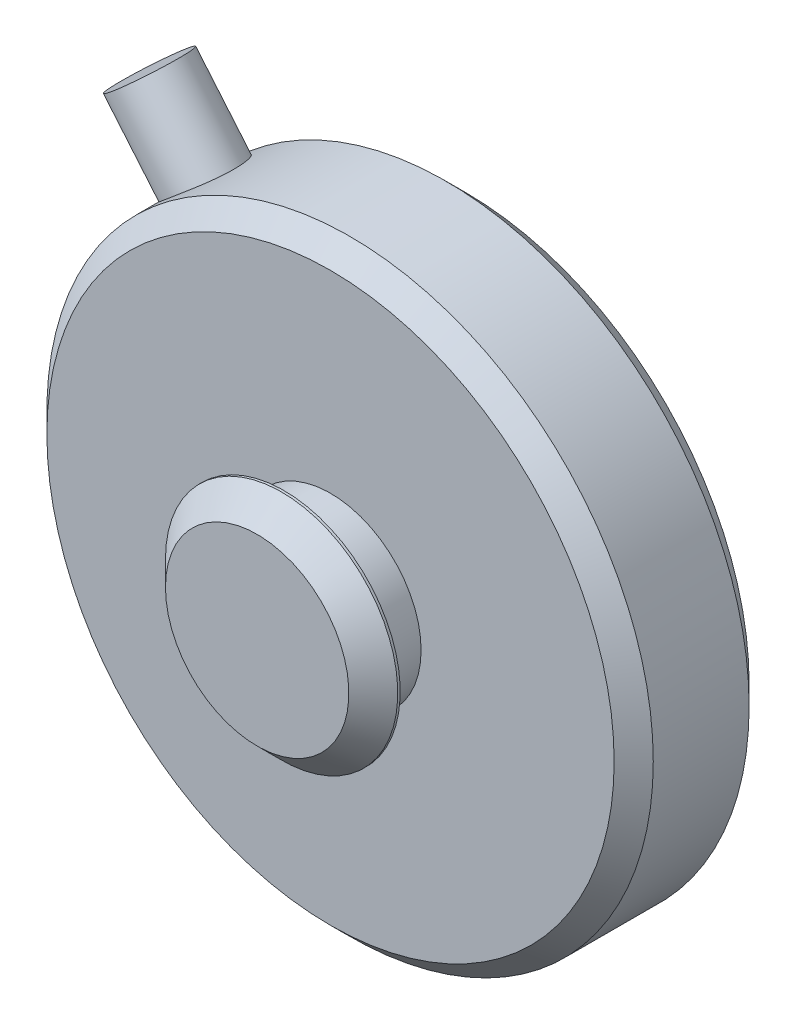
ISO-10303-21;
HEADER;
FILE_DESCRIPTION(('STEP AP214'),'2;1');
FILE_NAME('part.step','',(''),(''),'','','');
FILE_SCHEMA(('AUTOMOTIVE_DESIGN { 1 0 10303 214 1 1 1 1 }'));
ENDSEC;
DATA;
#1=APPLICATION_CONTEXT('core data for automotive mechanical design processes');
#2=APPLICATION_PROTOCOL_DEFINITION('international standard','automotive_design',2000,#1);
#3=PRODUCT_CONTEXT('',#1,'mechanical');
#4=PRODUCT('Part','Part','',(#3));
#5=PRODUCT_RELATED_PRODUCT_CATEGORY('part','',(#4));
#6=PRODUCT_DEFINITION_FORMATION('','',#4);
#7=PRODUCT_DEFINITION_CONTEXT('part definition',#1,'design');
#8=PRODUCT_DEFINITION('design','',#6,#7);
#9=PRODUCT_DEFINITION_SHAPE('','',#8);
#10=(LENGTH_UNIT() NAMED_UNIT(*) SI_UNIT(.MILLI.,.METRE.));
#11=(NAMED_UNIT(*) PLANE_ANGLE_UNIT() SI_UNIT($,.RADIAN.));
#12=(NAMED_UNIT(*) SI_UNIT($,.STERADIAN.) SOLID_ANGLE_UNIT());
#13=UNCERTAINTY_MEASURE_WITH_UNIT(LENGTH_MEASURE(1.E-05),#10,'distance_accuracy_value','');
#14=(GEOMETRIC_REPRESENTATION_CONTEXT(3) GLOBAL_UNCERTAINTY_ASSIGNED_CONTEXT((#13)) GLOBAL_UNIT_ASSIGNED_CONTEXT((#10,
#11,#12)) REPRESENTATION_CONTEXT('',''));
#15=CARTESIAN_POINT('',(0.,0.,0.));
#16=DIRECTION('',(0.,0.,1.));
#17=DIRECTION('',(1.,0.,0.));
#18=AXIS2_PLACEMENT_3D('',#15,#16,#17);
#19=CARTESIAN_POINT('',(0.,0.,70.104));
#20=DIRECTION('',(0.,0.,-1.));
#21=DIRECTION('',(-1.,0.,0.));
#22=AXIS2_PLACEMENT_3D('',#19,#20,#21);
#23=CYLINDRICAL_SURFACE('',#22,157.48);
#24=CARTESIAN_POINT('',(0.,0.,59.944));
#25=DIRECTION('',(0.,0.,1.));
#26=DIRECTION('',(1.,0.,0.));
#27=AXIS2_PLACEMENT_3D('',#24,#25,#26);
#28=CIRCLE('',#27,157.48);
#29=CARTESIAN_POINT('',(157.48,0.,59.944));
#30=VERTEX_POINT('',#29);
#31=EDGE_CURVE('E63',#30,#30,#28,.F.);
#32=ORIENTED_EDGE('',*,*,#31,.T.);
#33=EDGE_LOOP('',(#32));
#34=FACE_BOUND('',#33,.T.);
#35=CARTESIAN_POINT('',(0.,0.,10.1600000000001));
#36=DIRECTION('',(0.,0.,1.));
#37=DIRECTION('',(1.,0.,0.));
#38=AXIS2_PLACEMENT_3D('',#35,#36,#37);
#39=CIRCLE('',#38,157.48);
#40=CARTESIAN_POINT('',(157.48,0.,10.1600000000001));
#41=VERTEX_POINT('',#40);
#42=EDGE_CURVE('E60',#41,#41,#39,.T.);
#43=ORIENTED_EDGE('',*,*,#42,.T.);
#44=EDGE_LOOP('',(#43));
#45=FACE_BOUND('',#44,.T.);
#46=CARTESIAN_POINT('',(-115.075978669095,107.505672098499,34.2900000000001));
#47=CARTESIAN_POINT('',(-115.075981956231,107.505666742398,34.8231063645392));
#48=CARTESIAN_POINT('',(-115.060586298273,107.522154970393,35.3561246507377));
#49=CARTESIAN_POINT('',(-114.999081791675,107.587934793928,36.4185207814599));
#50=CARTESIAN_POINT('',(-114.952965908508,107.637233902726,36.9478977641156));
#51=CARTESIAN_POINT('',(-114.830182011273,107.768212945769,37.999561538486));
#52=CARTESIAN_POINT('',(-114.753484488234,107.849924154846,38.5218409767915));
#53=CARTESIAN_POINT('',(-114.569928895355,108.044896704996,39.5550578291863));
#54=CARTESIAN_POINT('',(-114.463072542118,108.15815625037,40.0659958870284));
#55=CARTESIAN_POINT('',(-114.219812022387,108.415018236476,41.0726169164407));
#56=CARTESIAN_POINT('',(-114.083427134799,108.558600878043,41.5683096015502));
#57=CARTESIAN_POINT('',(-113.781749375362,108.874751977493,42.541319621696));
#58=CARTESIAN_POINT('',(-113.616456117651,109.047320822275,43.0186367113549));
#59=CARTESIAN_POINT('',(-113.257825785251,109.419751779565,43.9514752054481));
#60=CARTESIAN_POINT('',(-113.064494010221,109.619608733833,44.4070007071977));
#61=CARTESIAN_POINT('',(-112.650739051799,110.044760620328,45.2931968527398));
#62=CARTESIAN_POINT('',(-112.430315851306,110.270055568614,45.7238674808425));
#63=CARTESIAN_POINT('',(-111.962406154477,110.745120183841,46.5593366116437));
#64=CARTESIAN_POINT('',(-111.714797577077,110.994999683982,46.9640042978188));
#65=CARTESIAN_POINT('',(-111.194663765932,111.516064408958,47.7424304563291));
#66=CARTESIAN_POINT('',(-110.922138438299,111.787249714073,48.1161888121879));
#67=CARTESIAN_POINT('',(-110.353615515967,112.348517875241,48.8302012335807));
#68=CARTESIAN_POINT('',(-110.057616788187,112.638601643418,49.1704536799792));
#69=CARTESIAN_POINT('',(-109.44378578764,113.235114993216,49.8150420046939));
#70=CARTESIAN_POINT('',(-109.125953499928,113.541544586026,50.1193778584249));
#71=CARTESIAN_POINT('',(-108.469240176414,114.169090410847,50.6908610778762));
#72=CARTESIAN_POINT('',(-108.130296918057,114.490249243946,50.9578901817623));
#73=CARTESIAN_POINT('',(-107.434257054097,115.143643443496,51.4517128745542));
#74=CARTESIAN_POINT('',(-107.077160398733,115.475878840309,51.6785063531605));
#75=CARTESIAN_POINT('',(-106.347013211455,116.148652932663,52.0901974622468));
#76=CARTESIAN_POINT('',(-105.973963113776,116.489191402096,52.2750962321918));
#77=CARTESIAN_POINT('',(-105.214274007777,117.175804053988,52.6016406523737));
#78=CARTESIAN_POINT('',(-104.827635070674,117.521878207428,52.7432865292575));
#79=CARTESIAN_POINT('',(-104.045243230053,118.215098775633,52.9816833330641));
#80=CARTESIAN_POINT('',(-103.64954437086,118.562231591539,53.0786511904845));
#81=CARTESIAN_POINT('',(-102.849887640687,119.256577965041,53.2279910066635));
#82=CARTESIAN_POINT('',(-102.445929793943,119.603791522399,53.2803630962758));
#83=CARTESIAN_POINT('',(-101.632582652601,120.29569234035,53.3401184129735));
#84=CARTESIAN_POINT('',(-101.223193536414,120.640379683352,53.3475031141921));
#85=CARTESIAN_POINT('',(-100.401903143218,121.324745880084,53.317232068117));
#86=CARTESIAN_POINT('',(-99.9900018732307,121.6644247478,53.2795764466276));
#87=CARTESIAN_POINT('',(-99.1688658755673,122.334646981106,53.1598223038452));
#88=CARTESIAN_POINT('',(-98.7596284767233,122.665228861847,53.0779574712857));
#89=CARTESIAN_POINT('',(-97.9446920025025,123.316908507528,52.870542975148));
#90=CARTESIAN_POINT('',(-97.5389929127791,123.638006310933,52.7449934887797));
#91=CARTESIAN_POINT('',(-96.7341876806402,124.268695700632,52.4511279111364));
#92=CARTESIAN_POINT('',(-96.3350816205461,124.578287143315,52.2828112862944));
#93=CARTESIAN_POINT('',(-95.5465241954109,125.184101837674,51.9046332667945));
#94=CARTESIAN_POINT('',(-95.1570728672098,125.480325038344,51.6947717136389));
#95=CARTESIAN_POINT('',(-94.3898841037624,126.058444746087,51.2344289510525));
#96=CARTESIAN_POINT('',(-94.0121787249038,126.340303194494,50.9838465270971));
#97=CARTESIAN_POINT('',(-93.2725033577813,126.887360099209,50.4442266836837));
#98=CARTESIAN_POINT('',(-92.9105333862832,127.152558537767,50.155189223254));
#99=CARTESIAN_POINT('',(-92.2052195127385,127.664944057862,49.5406858401647));
#100=CARTESIAN_POINT('',(-91.8618762864209,127.912130486082,49.2152185972397));
#101=CARTESIAN_POINT('',(-91.1966230344424,128.387279240893,48.5301370664299));
#102=CARTESIAN_POINT('',(-90.8747131052486,128.61524148096,48.1705226248731));
#103=CARTESIAN_POINT('',(-90.2530000511413,129.052282924288,47.4172333901064));
#104=CARTESIAN_POINT('',(-89.9533518088281,129.261231761214,47.0233551005706));
#105=CARTESIAN_POINT('',(-89.3810090028774,129.657652510021,46.206294621352));
#106=CARTESIAN_POINT('',(-89.1083145614574,129.845124324518,45.7831122988098));
#107=CARTESIAN_POINT('',(-88.5922411438221,130.197783871449,44.910401486561));
#108=CARTESIAN_POINT('',(-88.348862325544,130.362971483828,44.4608728549337));
#109=CARTESIAN_POINT('',(-87.8935703612461,130.670372211277,43.5386229127299));
#110=CARTESIAN_POINT('',(-87.6816571584481,130.812585367804,43.0659016440055));
#111=CARTESIAN_POINT('',(-87.2911248910344,131.073510372118,42.1004055644499));
#112=CARTESIAN_POINT('',(-87.1125188199588,131.192213049281,41.6076230184085));
#113=CARTESIAN_POINT('',(-86.7903383881949,131.405574174539,40.6056701132744));
#114=CARTESIAN_POINT('',(-86.6467640621405,131.500232598862,40.0964997379804));
#115=CARTESIAN_POINT('',(-86.3959878617275,131.665129116188,39.0654256454396));
#116=CARTESIAN_POINT('',(-86.2887846466326,131.735368109359,38.5435223983209));
#117=CARTESIAN_POINT('',(-86.1117546335724,131.851155931425,37.4907159182353));
#118=CARTESIAN_POINT('',(-86.041927627356,131.896704897886,36.9598127354308));
#119=CARTESIAN_POINT('',(-85.9406352304232,131.962726756453,35.8962153645797));
#120=CARTESIAN_POINT('',(-85.9089300963237,131.983356366907,35.3635537209783));
#121=CARTESIAN_POINT('',(-85.8833798063421,131.999983748173,34.2969405307324));
#122=CARTESIAN_POINT('',(-85.8895344918539,131.995981622176,33.762988989501));
#123=CARTESIAN_POINT('',(-85.9396448803183,131.963361300718,32.6976287312437));
#124=CARTESIAN_POINT('',(-85.983599862889,131.93474357437,32.1662199659528));
#125=CARTESIAN_POINT('',(-86.1088948759833,131.853002264134,31.1097332275515));
#126=CARTESIAN_POINT('',(-86.1902348873098,131.799878692829,30.5846552511905));
#127=CARTESIAN_POINT('',(-86.389222617466,131.669535941278,29.5462100839902));
#128=CARTESIAN_POINT('',(-86.5067550741846,131.592393246204,29.0328111946997));
#129=CARTESIAN_POINT('',(-86.7771279890669,131.414255853258,28.0196327138986));
#130=CARTESIAN_POINT('',(-86.9299683477337,131.3132612226,27.5198530840137));
#131=CARTESIAN_POINT('',(-87.2695728571734,131.087808599911,26.5373922142867));
#132=CARTESIAN_POINT('',(-87.4563378747376,130.963350008362,26.0547114117045));
#133=CARTESIAN_POINT('',(-87.8621201247093,130.69146054306,25.1098106510844));
#134=CARTESIAN_POINT('',(-88.0811375218974,130.544029551937,24.6475907975991));
#135=CARTESIAN_POINT('',(-88.5506620020646,130.226001315349,23.7445718135778));
#136=CARTESIAN_POINT('',(-88.8013196579117,130.055292960939,23.3038900991474));
#137=CARTESIAN_POINT('',(-89.3310832667231,129.691985423839,22.4494743074258));
#138=CARTESIAN_POINT('',(-89.6101893022965,129.499386177581,22.0357403083918));
#139=CARTESIAN_POINT('',(-90.1944731289451,129.093121387352,21.238076299478));
#140=CARTESIAN_POINT('',(-90.4996517576856,128.879455166504,20.8541472479344));
#141=CARTESIAN_POINT('',(-91.1335095634046,128.432022052273,20.1187742987307));
#142=CARTESIAN_POINT('',(-91.4621888069585,128.198255101946,19.7673304931051));
#143=CARTESIAN_POINT('',(-92.1421422377958,127.710422410367,19.097598153332));
#144=CARTESIAN_POINT('',(-92.4935276187735,127.45625502429,18.7794965143477));
#145=CARTESIAN_POINT('',(-93.2144148588049,126.929990084886,18.1808666796957));
#146=CARTESIAN_POINT('',(-93.5839167921586,126.657892458021,17.9003386381435));
#147=CARTESIAN_POINT('',(-94.33803348661,126.097210762074,17.3788744943235));
#148=CARTESIAN_POINT('',(-94.7226480457642,125.808626913269,17.1379378632357));
#149=CARTESIAN_POINT('',(-95.5039147699875,125.216583771448,16.6974026099164));
#150=CARTESIAN_POINT('',(-95.9005668875399,124.913124537148,16.4978038245341));
#151=CARTESIAN_POINT('',(-96.701758906016,124.293909273488,16.14186229683));
#152=CARTESIAN_POINT('',(-97.1062762356809,123.97818640399,15.9854110689521));
#153=CARTESIAN_POINT('',(-97.9210400549139,123.335677947544,15.7162513634477));
#154=CARTESIAN_POINT('',(-98.3312865382727,123.008892372587,15.6035428384159));
#155=CARTESIAN_POINT('',(-99.1543683983212,122.346396329997,15.4227125789214));
#156=CARTESIAN_POINT('',(-99.5672036831479,122.010686177697,15.3545892712998));
#157=CARTESIAN_POINT('',(-100.392389873754,121.332615650315,15.2634350475816));
#158=CARTESIAN_POINT('',(-100.804740781755,120.990255305852,15.240403923914));
#159=CARTESIAN_POINT('',(-101.623317006693,120.303513846195,15.2396091573007));
#160=CARTESIAN_POINT('',(-102.029564627974,119.959159615326,15.2615572496468));
#161=CARTESIAN_POINT('',(-102.835742904735,119.268780578809,15.3499778537598));
#162=CARTESIAN_POINT('',(-103.235673589019,118.922755780788,15.4164501624378));
#163=CARTESIAN_POINT('',(-104.026480891724,118.231626257682,15.5934258843502));
#164=CARTESIAN_POINT('',(-104.417357536762,117.886521529895,15.7039291681235));
#165=CARTESIAN_POINT('',(-105.18746790316,117.199885461876,15.9681529631312));
#166=CARTESIAN_POINT('',(-105.56670160326,116.85835412817,16.1218735532708));
#167=CARTESIAN_POINT('',(-106.310979851016,116.181663254184,16.4713549182159));
#168=CARTESIAN_POINT('',(-106.67602880444,115.846501752234,16.6671025141979));
#169=CARTESIAN_POINT('',(-107.389809310632,115.185137968591,17.0992534986387));
#170=CARTESIAN_POINT('',(-107.738540876198,114.85893567987,17.3356568552079));
#171=CARTESIAN_POINT('',(-108.417612288711,114.218167168577,17.8474338079367));
#172=CARTESIAN_POINT('',(-108.747952111214,113.903600961469,18.1228074558871));
#173=CARTESIAN_POINT('',(-109.388343926948,113.288735948809,18.7105832724219));
#174=CARTESIAN_POINT('',(-109.698395831342,112.988437205733,19.0229856031296));
#175=CARTESIAN_POINT('',(-110.298326557156,112.402875282886,19.6846636721671));
#176=CARTESIAN_POINT('',(-110.588069902347,112.117715683798,20.0341539319831));
#177=CARTESIAN_POINT('',(-111.143697266452,111.566939641962,20.7659623401381));
#178=CARTESIAN_POINT('',(-111.409581106397,111.301323345811,21.148280734678));
#179=CARTESIAN_POINT('',(-111.916136460886,110.79195767178,21.943172739707));
#180=CARTESIAN_POINT('',(-112.156801860842,110.548213599199,22.3557536467619));
#181=CARTESIAN_POINT('',(-112.611589894974,110.084901928611,23.2082077345002));
#182=CARTESIAN_POINT('',(-112.82571287981,109.86533401121,23.6480805545056));
#183=CARTESIAN_POINT('',(-113.22704485836,109.451679283116,24.5536896065374));
#184=CARTESIAN_POINT('',(-113.414153942452,109.257687282268,25.0195134408414));
#185=CARTESIAN_POINT('',(-113.75958682009,108.897975279947,25.9723066327804));
#186=CARTESIAN_POINT('',(-113.917908845469,108.732257015151,26.4592772870285));
#187=CARTESIAN_POINT('',(-114.204804233235,108.430882991487,27.4504000365124));
#188=CARTESIAN_POINT('',(-114.333407348545,108.295197171596,27.9545343630279));
#189=CARTESIAN_POINT('',(-114.56038362123,108.055060640918,28.9766734760748));
#190=CARTESIAN_POINT('',(-114.65876396539,107.950602504541,29.4946749331886));
#191=CARTESIAN_POINT('',(-114.852841605464,107.744150385155,30.7174912110674));
#192=CARTESIAN_POINT('',(-114.936463317268,107.654848379762,31.4264368991206));
#193=CARTESIAN_POINT('',(-115.048029442311,107.535613049452,32.8536417052711));
#194=CARTESIAN_POINT('',(-115.075974241292,107.505679313216,33.5719007588082));
#195=CARTESIAN_POINT('',(-115.075978669095,107.505672098499,34.2900000000001));
#196=B_SPLINE_CURVE_WITH_KNOTS('',3,(#46,#47,#48,#49,#50,#51,#52,#53,#54,#55,#56,#57,#58,#59,
#60,#61,#62,#63,#64,#65,#66,#67,#68,#69,#70,#71,#72,#73,#74,#75,#76,#77,#78,#79,#80,#81,#82,#83,
#84,#85,#86,#87,#88,#89,#90,#91,#92,#93,#94,#95,#96,#97,#98,#99,#100,#101,#102,#103,#104,#105,
#106,#107,#108,#109,#110,#111,#112,#113,#114,#115,#116,#117,#118,#119,#120,#121,#122,#123,#124,
#125,#126,#127,#128,#129,#130,#131,#132,#133,#134,#135,#136,#137,#138,#139,#140,#141,#142,#143,
#144,#145,#146,#147,#148,#149,#150,#151,#152,#153,#154,#155,#156,#157,#158,#159,#160,#161,#162,
#163,#164,#165,#166,#167,#168,#169,#170,#171,#172,#173,#174,#175,#176,#177,#178,#179,#180,#181,
#182,#183,#184,#185,#186,#187,#188,#189,#190,#191,#192,#193,#194,#195),.UNSPECIFIED.,.T.,.F.,(4,
2,2,2,2,2,2,2,2,2,2,2,2,2,2,2,2,2,2,2,2,2,2,2,2,2,2,2,2,2,2,2,2,2,2,2,2,2,2,2,2,2,2,2,2,2,2,2,2,
2,2,2,2,2,2,2,2,2,2,2,2,2,2,2,2,2,2,2,2,2,2,2,2,2,4),(0.,1.5986906597407,3.19774752452833,
4.79835110689439,6.39886360321042,7.99833427405036,9.59782629593038,11.1970163852108,
12.7962074839783,14.4028989590735,16.0095964884345,17.6163716215878,19.2231478545913,
20.83490726724,22.4466710981978,24.0583910866516,25.6701026294879,27.2739039619148,
28.8777005884217,30.4814446619199,32.0851842559325,33.6805283378331,35.2758659481809,
36.8712234630946,38.4665870645647,40.0659784708004,41.6653715811106,43.2648226744108,
44.8642809660384,46.4739888170811,48.0837039667334,49.6934277882969,51.3031487051589,
52.9134962871313,54.5238454611513,56.1341352669428,57.7444161005045,59.3445162198905,
60.9446096359813,62.544672558852,64.144734660091,65.7397528399694,67.3347665251799,
68.9298209694933,70.524883563375,72.1278452747064,73.7308116408918,75.3338295268747,
76.936851954258,78.548426893619,80.1600084429621,81.7715684647554,83.3831221259694,
84.9905861437894,86.5980484195471,88.2054539740405,89.8128521292156,91.4099809432266,
93.0071024722776,94.6042193054552,96.2013390546257,97.7979587087488,99.3945771105179,
100.991197634181,102.587825148613,104.194250939961,105.800688780057,107.40751522819,
109.014320445728,110.626923951549,112.239626473833,113.850707384709,115.46140489349,
117.61487103058,119.768322247867),.UNSPECIFIED.);
#197=CARTESIAN_POINT('',(-115.075978669095,107.505672098499,34.2900000000001));
#198=VERTEX_POINT('',#197);
#199=EDGE_CURVE('E10',#198,#198,#196,.T.);
#200=ORIENTED_EDGE('',*,*,#199,.F.);
#201=EDGE_LOOP('',(#200));
#202=FACE_BOUND('',#201,.T.);
#203=ADVANCED_FACE('F34',(#34,#45,#202),#23,.T.);
#204=CARTESIAN_POINT('',(0.,0.,-19.812));
#205=DIRECTION('',(0.,0.,-1.));
#206=DIRECTION('',(-1.,0.,0.));
#207=AXIS2_PLACEMENT_3D('',#204,#205,#206);
#208=PLANE('',#207);
#209=CARTESIAN_POINT('',(0.,0.,-19.812));
#210=DIRECTION('',(0.,0.,-1.));
#211=DIRECTION('',(-1.,0.,0.));
#212=AXIS2_PLACEMENT_3D('',#209,#210,#211);
#213=CIRCLE('',#212,24.511);
#214=CARTESIAN_POINT('',(-24.511,0.,-19.812));
#215=VERTEX_POINT('',#214);
#216=EDGE_CURVE('E78',#215,#215,#213,.T.);
#217=ORIENTED_EDGE('',*,*,#216,.T.);
#218=EDGE_LOOP('',(#217));
#219=FACE_BOUND('',#218,.T.);
#220=CARTESIAN_POINT('',(0.,0.,-19.812));
#221=DIRECTION('',(0.,0.,-1.));
#222=DIRECTION('',(-1.,0.,0.));
#223=AXIS2_PLACEMENT_3D('',#220,#221,#222);
#224=CIRCLE('',#223,15.875);
#225=CARTESIAN_POINT('',(-15.875,0.,-19.812));
#226=VERTEX_POINT('',#225);
#227=EDGE_CURVE('E87',#226,#226,#224,.T.);
#228=ORIENTED_EDGE('',*,*,#227,.F.);
#229=EDGE_LOOP('',(#228));
#230=FACE_BOUND('',#229,.T.);
#231=ADVANCED_FACE('F137',(#219,#230),#208,.T.);
#232=CARTESIAN_POINT('',(0.,0.,0.));
#233=DIRECTION('',(0.,0.,1.));
#234=DIRECTION('',(1.,0.,0.));
#235=AXIS2_PLACEMENT_3D('',#232,#233,#234);
#236=PLANE('',#235);
#237=CARTESIAN_POINT('',(0.,0.,0.));
#238=DIRECTION('',(0.,0.,1.));
#239=DIRECTION('',(1.,0.,0.));
#240=AXIS2_PLACEMENT_3D('',#237,#238,#239);
#241=CIRCLE('',#240,147.32);
#242=CARTESIAN_POINT('',(147.32,0.,0.));
#243=VERTEX_POINT('',#242);
#244=EDGE_CURVE('E57',#243,#243,#241,.F.);
#245=ORIENTED_EDGE('',*,*,#244,.T.);
#246=EDGE_LOOP('',(#245));
#247=FACE_BOUND('',#246,.T.);
#248=CARTESIAN_POINT('',(36.2352532708452,-11.7735474856859,0.));
#249=DIRECTION('',(0.,0.,-1.));
#250=DIRECTION('',(-0.309016994374958,-0.95105651629515,0.));
#251=AXIS2_PLACEMENT_3D('',#248,#249,#250);
#252=CIRCLE('',#251,3.175);
#253=CARTESIAN_POINT('',(35.2541243137047,-14.793151924923,0.));
#254=VERTEX_POINT('',#253);
#255=EDGE_CURVE('E117',#254,#254,#252,.T.);
#256=ORIENTED_EDGE('',*,*,#255,.F.);
#257=EDGE_LOOP('',(#256));
#258=FACE_BOUND('',#257,.T.);
#259=CARTESIAN_POINT('',(22.3946181123435,30.8235474856853,0.));
#260=DIRECTION('',(0.,0.,-1.));
#261=DIRECTION('',(0.809016994374942,-0.58778525229248,0.));
#262=AXIS2_PLACEMENT_3D('',#259,#260,#261);
#263=CIRCLE('',#262,3.175);
#264=CARTESIAN_POINT('',(24.9632470694839,28.9573293096567,0.));
#265=VERTEX_POINT('',#264);
#266=EDGE_CURVE('E111',#265,#265,#263,.T.);
#267=ORIENTED_EDGE('',*,*,#266,.F.);
#268=EDGE_LOOP('',(#267));
#269=FACE_BOUND('',#268,.T.);
#270=CARTESIAN_POINT('',(-22.3946181123431,30.8235474856856,0.));
#271=DIRECTION('',(0.,0.,-1.));
#272=DIRECTION('',(0.809016994374951,0.587785252292469,0.));
#273=AXIS2_PLACEMENT_3D('',#270,#271,#272);
#274=CIRCLE('',#273,3.175);
#275=CARTESIAN_POINT('',(-19.8259891552026,32.6897656617142,0.));
#276=VERTEX_POINT('',#275);
#277=EDGE_CURVE('E105',#276,#276,#274,.T.);
#278=ORIENTED_EDGE('',*,*,#277,.F.);
#279=EDGE_LOOP('',(#278));
#280=FACE_BOUND('',#279,.T.);
#281=CARTESIAN_POINT('',(-36.2352532708454,-11.7735474856854,0.));
#282=DIRECTION('',(0.,0.,-1.));
#283=DIRECTION('',(-0.309016994374945,0.951056516295155,0.));
#284=AXIS2_PLACEMENT_3D('',#281,#282,#283);
#285=CIRCLE('',#284,3.175);
#286=CARTESIAN_POINT('',(-37.2163822279858,-8.75394304644828,0.));
#287=VERTEX_POINT('',#286);
#288=EDGE_CURVE('E99',#287,#287,#285,.T.);
#289=ORIENTED_EDGE('',*,*,#288,.F.);
#290=EDGE_LOOP('',(#289));
#291=FACE_BOUND('',#290,.T.);
#292=CARTESIAN_POINT('',(0.,-38.1,0.));
#293=DIRECTION('',(0.,0.,-1.));
#294=DIRECTION('',(-1.,0.,0.));
#295=AXIS2_PLACEMENT_3D('',#292,#293,#294);
#296=CIRCLE('',#295,3.175);
#297=CARTESIAN_POINT('',(-3.175,-38.1,0.));
#298=VERTEX_POINT('',#297);
#299=EDGE_CURVE('E93',#298,#298,#296,.T.);
#300=ORIENTED_EDGE('',*,*,#299,.F.);
#301=EDGE_LOOP('',(#300));
#302=FACE_BOUND('',#301,.T.);
#303=CARTESIAN_POINT('',(0.,0.,0.));
#304=DIRECTION('',(0.,0.,1.));
#305=DIRECTION('',(1.,0.,0.));
#306=AXIS2_PLACEMENT_3D('',#303,#304,#305);
#307=CIRCLE('',#306,15.0114);
#308=CARTESIAN_POINT('',(15.0114,0.,0.));
#309=VERTEX_POINT('',#308);
#310=EDGE_CURVE('E66',#309,#309,#307,.F.);
#311=ORIENTED_EDGE('',*,*,#310,.F.);
#312=EDGE_LOOP('',(#311));
#313=FACE_BOUND('',#312,.T.);
#314=ADVANCED_FACE('F142',(#247,#258,#269,#280,#291,#302,#313),#236,.F.);
#315=CARTESIAN_POINT('',(0.,0.,70.104));
#316=DIRECTION('',(0.,0.,1.));
#317=DIRECTION('',(1.,0.,0.));
#318=AXIS2_PLACEMENT_3D('',#315,#316,#317);
#319=PLANE('',#318);
#320=CARTESIAN_POINT('',(0.,0.,70.104));
#321=DIRECTION('',(0.,0.,1.));
#322=DIRECTION('',(1.,0.,0.));
#323=AXIS2_PLACEMENT_3D('',#320,#321,#322);
#324=CIRCLE('',#323,147.32);
#325=CARTESIAN_POINT('',(147.32,0.,70.104));
#326=VERTEX_POINT('',#325);
#327=EDGE_CURVE('E52',#326,#326,#324,.T.);
#328=ORIENTED_EDGE('',*,*,#327,.T.);
#329=EDGE_LOOP('',(#328));
#330=FACE_BOUND('',#329,.T.);
#331=CARTESIAN_POINT('',(0.,0.,70.104));
#332=DIRECTION('',(0.,0.,1.));
#333=DIRECTION('',(1.,0.,0.));
#334=AXIS2_PLACEMENT_3D('',#331,#332,#333);
#335=CIRCLE('',#334,47.0535);
#336=CARTESIAN_POINT('',(47.0535,0.,70.104));
#337=VERTEX_POINT('',#336);
#338=EDGE_CURVE('E72',#337,#337,#335,.T.);
#339=ORIENTED_EDGE('',*,*,#338,.F.);
#340=EDGE_LOOP('',(#339));
#341=FACE_BOUND('',#340,.T.);
#342=ADVANCED_FACE('F237',(#330,#341),#319,.T.);
#343=CARTESIAN_POINT('',(0.,0.,94.234));
#344=DIRECTION('',(0.,0.,-1.));
#345=DIRECTION('',(-1.,0.,0.));
#346=AXIS2_PLACEMENT_3D('',#343,#344,#345);
#347=CYLINDRICAL_SURFACE('',#346,47.0535);
#348=CARTESIAN_POINT('',(0.,0.,94.234));
#349=DIRECTION('',(0.,0.,1.));
#350=DIRECTION('',(1.,0.,0.));
#351=AXIS2_PLACEMENT_3D('',#348,#349,#350);
#352=CIRCLE('',#351,47.0535);
#353=CARTESIAN_POINT('',(47.0535,0.,94.234));
#354=VERTEX_POINT('',#353);
#355=EDGE_CURVE('E69',#354,#354,#352,.T.);
#356=ORIENTED_EDGE('',*,*,#355,.F.);
#357=EDGE_LOOP('',(#356));
#358=FACE_BOUND('',#357,.T.);
#359=ORIENTED_EDGE('',*,*,#338,.T.);
#360=EDGE_LOOP('',(#359));
#361=FACE_BOUND('',#360,.T.);
#362=ADVANCED_FACE('F233',(#358,#361),#347,.T.);
#363=CARTESIAN_POINT('',(0.,0.,-13.462));
#364=DIRECTION('',(0.,0.,1.));
#365=DIRECTION('',(1.,0.,0.));
#366=AXIS2_PLACEMENT_3D('',#363,#364,#365);
#367=CYLINDRICAL_SURFACE('',#366,15.0114);
#368=CARTESIAN_POINT('',(0.,0.,-13.462));
#369=DIRECTION('',(0.,0.,-1.));
#370=DIRECTION('',(-1.,0.,0.));
#371=AXIS2_PLACEMENT_3D('',#368,#369,#370);
#372=CIRCLE('',#371,15.0114);
#373=CARTESIAN_POINT('',(-15.0114,0.,-13.462));
#374=VERTEX_POINT('',#373);
#375=EDGE_CURVE('E75',#374,#374,#372,.T.);
#376=ORIENTED_EDGE('',*,*,#375,.F.);
#377=EDGE_LOOP('',(#376));
#378=FACE_BOUND('',#377,.T.);
#379=ORIENTED_EDGE('',*,*,#310,.T.);
#380=EDGE_LOOP('',(#379));
#381=FACE_BOUND('',#380,.T.);
#382=ADVANCED_FACE('F225',(#378,#381),#367,.T.);
#383=CARTESIAN_POINT('',(0.,0.,-13.462));
#384=DIRECTION('',(0.,0.,-1.));
#385=DIRECTION('',(-1.,0.,0.));
#386=AXIS2_PLACEMENT_3D('',#383,#384,#385);
#387=PLANE('',#386);
#388=CARTESIAN_POINT('',(0.,0.,-13.462));
#389=DIRECTION('',(0.,0.,-1.));
#390=DIRECTION('',(-1.,0.,0.));
#391=AXIS2_PLACEMENT_3D('',#388,#389,#390);
#392=CIRCLE('',#391,24.511);
#393=CARTESIAN_POINT('',(-24.511,0.,-13.462));
#394=VERTEX_POINT('',#393);
#395=EDGE_CURVE('E81',#394,#394,#392,.T.);
#396=ORIENTED_EDGE('',*,*,#395,.F.);
#397=EDGE_LOOP('',(#396));
#398=FACE_BOUND('',#397,.T.);
#399=ORIENTED_EDGE('',*,*,#375,.T.);
#400=EDGE_LOOP('',(#399));
#401=FACE_BOUND('',#400,.T.);
#402=ADVANCED_FACE('F223',(#398,#401),#387,.F.);
#403=CARTESIAN_POINT('',(0.,0.,-19.812));
#404=DIRECTION('',(0.,0.,1.));
#405=DIRECTION('',(1.,0.,0.));
#406=AXIS2_PLACEMENT_3D('',#403,#404,#405);
#407=CYLINDRICAL_SURFACE('',#406,24.511);
#408=ORIENTED_EDGE('',*,*,#216,.F.);
#409=EDGE_LOOP('',(#408));
#410=FACE_BOUND('',#409,.T.);
#411=ORIENTED_EDGE('',*,*,#395,.T.);
#412=EDGE_LOOP('',(#411));
#413=FACE_BOUND('',#412,.T.);
#414=ADVANCED_FACE('F221',(#410,#413),#407,.T.);
#415=CARTESIAN_POINT('',(0.,0.,-26.67));
#416=DIRECTION('',(0.,0.,1.));
#417=DIRECTION('',(1.,0.,0.));
#418=AXIS2_PLACEMENT_3D('',#415,#416,#417);
#419=CYLINDRICAL_SURFACE('',#418,15.875);
#420=CARTESIAN_POINT('',(0.,0.,-26.67));
#421=DIRECTION('',(0.,0.,-1.));
#422=DIRECTION('',(-1.,0.,0.));
#423=AXIS2_PLACEMENT_3D('',#420,#421,#422);
#424=CIRCLE('',#423,15.875);
#425=CARTESIAN_POINT('',(-15.875,0.,-26.67));
#426=VERTEX_POINT('',#425);
#427=EDGE_CURVE('E84',#426,#426,#424,.T.);
#428=ORIENTED_EDGE('',*,*,#427,.F.);
#429=EDGE_LOOP('',(#428));
#430=FACE_BOUND('',#429,.T.);
#431=ORIENTED_EDGE('',*,*,#227,.T.);
#432=EDGE_LOOP('',(#431));
#433=FACE_BOUND('',#432,.T.);
#434=ADVANCED_FACE('F217',(#430,#433),#419,.T.);
#435=CARTESIAN_POINT('',(0.,0.,-26.67));
#436=DIRECTION('',(0.,0.,-1.));
#437=DIRECTION('',(-1.,0.,0.));
#438=AXIS2_PLACEMENT_3D('',#435,#436,#437);
#439=PLANE('',#438);
#440=ORIENTED_EDGE('',*,*,#427,.T.);
#441=EDGE_LOOP('',(#440));
#442=FACE_BOUND('',#441,.T.);
#443=ADVANCED_FACE('F213',(#442),#439,.T.);
#444=CARTESIAN_POINT('',(0.,-38.1,11.43));
#445=DIRECTION('',(0.,0.,-1.));
#446=DIRECTION('',(-1.,0.,0.));
#447=AXIS2_PLACEMENT_3D('',#444,#445,#446);
#448=CYLINDRICAL_SURFACE('',#447,3.175);
#449=CARTESIAN_POINT('',(0.,-38.1,11.43));
#450=DIRECTION('',(0.,0.,-1.));
#451=DIRECTION('',(-1.,0.,0.));
#452=AXIS2_PLACEMENT_3D('',#449,#450,#451);
#453=CIRCLE('',#452,3.175);
#454=CARTESIAN_POINT('',(-3.175,-38.1,11.43));
#455=VERTEX_POINT('',#454);
#456=EDGE_CURVE('E90',#455,#455,#453,.T.);
#457=ORIENTED_EDGE('',*,*,#456,.F.);
#458=EDGE_LOOP('',(#457));
#459=FACE_BOUND('',#458,.T.);
#460=ORIENTED_EDGE('',*,*,#299,.T.);
#461=EDGE_LOOP('',(#460));
#462=FACE_BOUND('',#461,.T.);
#463=ADVANCED_FACE('F209',(#459,#462),#448,.F.);
#464=CARTESIAN_POINT('',(0.,-38.1,11.43));
#465=DIRECTION('',(0.,0.,-1.));
#466=DIRECTION('',(-1.,0.,0.));
#467=AXIS2_PLACEMENT_3D('',#464,#465,#466);
#468=PLANE('',#467);
#469=ORIENTED_EDGE('',*,*,#456,.T.);
#470=EDGE_LOOP('',(#469));
#471=FACE_BOUND('',#470,.T.);
#472=ADVANCED_FACE('F205',(#471),#468,.T.);
#473=CARTESIAN_POINT('',(-36.2352532708454,-11.7735474856854,11.43));
#474=DIRECTION('',(0.,0.,-1.));
#475=DIRECTION('',(-1.,0.,0.));
#476=AXIS2_PLACEMENT_3D('',#473,#474,#475);
#477=CYLINDRICAL_SURFACE('',#476,3.175);
#478=CARTESIAN_POINT('',(-36.2352532708454,-11.7735474856854,11.43));
#479=DIRECTION('',(0.,0.,-1.));
#480=DIRECTION('',(-0.309016994374945,0.951056516295155,0.));
#481=AXIS2_PLACEMENT_3D('',#478,#479,#480);
#482=CIRCLE('',#481,3.175);
#483=CARTESIAN_POINT('',(-37.2163822279858,-8.75394304644828,11.43));
#484=VERTEX_POINT('',#483);
#485=EDGE_CURVE('E96',#484,#484,#482,.T.);
#486=ORIENTED_EDGE('',*,*,#485,.F.);
#487=EDGE_LOOP('',(#486));
#488=FACE_BOUND('',#487,.T.);
#489=ORIENTED_EDGE('',*,*,#288,.T.);
#490=EDGE_LOOP('',(#489));
#491=FACE_BOUND('',#490,.T.);
#492=ADVANCED_FACE('F201',(#488,#491),#477,.F.);
#493=CARTESIAN_POINT('',(-36.2352532708454,-11.7735474856854,11.43));
#494=DIRECTION('',(0.,0.,-1.));
#495=DIRECTION('',(-0.309016994374945,0.951056516295155,0.));
#496=AXIS2_PLACEMENT_3D('',#493,#494,#495);
#497=PLANE('',#496);
#498=ORIENTED_EDGE('',*,*,#485,.T.);
#499=EDGE_LOOP('',(#498));
#500=FACE_BOUND('',#499,.T.);
#501=ADVANCED_FACE('F197',(#500),#497,.T.);
#502=CARTESIAN_POINT('',(-22.3946181123431,30.8235474856856,11.43));
#503=DIRECTION('',(0.,0.,-1.));
#504=DIRECTION('',(-1.,0.,0.));
#505=AXIS2_PLACEMENT_3D('',#502,#503,#504);
#506=CYLINDRICAL_SURFACE('',#505,3.175);
#507=CARTESIAN_POINT('',(-22.3946181123431,30.8235474856856,11.43));
#508=DIRECTION('',(0.,0.,-1.));
#509=DIRECTION('',(0.809016994374951,0.587785252292469,0.));
#510=AXIS2_PLACEMENT_3D('',#507,#508,#509);
#511=CIRCLE('',#510,3.175);
#512=CARTESIAN_POINT('',(-19.8259891552026,32.6897656617142,11.43));
#513=VERTEX_POINT('',#512);
#514=EDGE_CURVE('E102',#513,#513,#511,.T.);
#515=ORIENTED_EDGE('',*,*,#514,.F.);
#516=EDGE_LOOP('',(#515));
#517=FACE_BOUND('',#516,.T.);
#518=ORIENTED_EDGE('',*,*,#277,.T.);
#519=EDGE_LOOP('',(#518));
#520=FACE_BOUND('',#519,.T.);
#521=ADVANCED_FACE('F193',(#517,#520),#506,.F.);
#522=CARTESIAN_POINT('',(-22.3946181123431,30.8235474856856,11.43));
#523=DIRECTION('',(0.,0.,-1.));
#524=DIRECTION('',(0.809016994374951,0.587785252292469,0.));
#525=AXIS2_PLACEMENT_3D('',#522,#523,#524);
#526=PLANE('',#525);
#527=ORIENTED_EDGE('',*,*,#514,.T.);
#528=EDGE_LOOP('',(#527));
#529=FACE_BOUND('',#528,.T.);
#530=ADVANCED_FACE('F189',(#529),#526,.T.);
#531=CARTESIAN_POINT('',(22.3946181123435,30.8235474856853,11.43));
#532=DIRECTION('',(0.,0.,-1.));
#533=DIRECTION('',(-1.,0.,0.));
#534=AXIS2_PLACEMENT_3D('',#531,#532,#533);
#535=CYLINDRICAL_SURFACE('',#534,3.175);
#536=CARTESIAN_POINT('',(22.3946181123435,30.8235474856853,11.43));
#537=DIRECTION('',(0.,0.,-1.));
#538=DIRECTION('',(0.809016994374942,-0.58778525229248,0.));
#539=AXIS2_PLACEMENT_3D('',#536,#537,#538);
#540=CIRCLE('',#539,3.175);
#541=CARTESIAN_POINT('',(24.9632470694839,28.9573293096567,11.43));
#542=VERTEX_POINT('',#541);
#543=EDGE_CURVE('E108',#542,#542,#540,.T.);
#544=ORIENTED_EDGE('',*,*,#543,.F.);
#545=EDGE_LOOP('',(#544));
#546=FACE_BOUND('',#545,.T.);
#547=ORIENTED_EDGE('',*,*,#266,.T.);
#548=EDGE_LOOP('',(#547));
#549=FACE_BOUND('',#548,.T.);
#550=ADVANCED_FACE('F185',(#546,#549),#535,.F.);
#551=CARTESIAN_POINT('',(22.3946181123435,30.8235474856853,11.43));
#552=DIRECTION('',(0.,0.,-1.));
#553=DIRECTION('',(0.809016994374942,-0.58778525229248,0.));
#554=AXIS2_PLACEMENT_3D('',#551,#552,#553);
#555=PLANE('',#554);
#556=ORIENTED_EDGE('',*,*,#543,.T.);
#557=EDGE_LOOP('',(#556));
#558=FACE_BOUND('',#557,.T.);
#559=ADVANCED_FACE('F181',(#558),#555,.T.);
#560=CARTESIAN_POINT('',(36.2352532708452,-11.7735474856859,11.43));
#561=DIRECTION('',(0.,0.,-1.));
#562=DIRECTION('',(-1.,0.,0.));
#563=AXIS2_PLACEMENT_3D('',#560,#561,#562);
#564=CYLINDRICAL_SURFACE('',#563,3.175);
#565=CARTESIAN_POINT('',(36.2352532708452,-11.7735474856859,11.43));
#566=DIRECTION('',(0.,0.,-1.));
#567=DIRECTION('',(-0.309016994374958,-0.95105651629515,0.));
#568=AXIS2_PLACEMENT_3D('',#565,#566,#567);
#569=CIRCLE('',#568,3.175);
#570=CARTESIAN_POINT('',(35.2541243137047,-14.793151924923,11.43));
#571=VERTEX_POINT('',#570);
#572=EDGE_CURVE('E114',#571,#571,#569,.T.);
#573=ORIENTED_EDGE('',*,*,#572,.F.);
#574=EDGE_LOOP('',(#573));
#575=FACE_BOUND('',#574,.T.);
#576=ORIENTED_EDGE('',*,*,#255,.T.);
#577=EDGE_LOOP('',(#576));
#578=FACE_BOUND('',#577,.T.);
#579=ADVANCED_FACE('F177',(#575,#578),#564,.F.);
#580=CARTESIAN_POINT('',(36.2352532708452,-11.7735474856859,11.43));
#581=DIRECTION('',(0.,0.,-1.));
#582=DIRECTION('',(-0.309016994374958,-0.95105651629515,0.));
#583=AXIS2_PLACEMENT_3D('',#580,#581,#582);
#584=PLANE('',#583);
#585=ORIENTED_EDGE('',*,*,#572,.T.);
#586=EDGE_LOOP('',(#585));
#587=FACE_BOUND('',#586,.T.);
#588=ADVANCED_FACE('F170',(#587),#584,.T.);
#589=CARTESIAN_POINT('',(0.,0.,94.234));
#590=DIRECTION('',(0.,0.,1.));
#591=DIRECTION('',(1.,0.,0.));
#592=AXIS2_PLACEMENT_3D('',#589,#590,#591);
#593=PLANE('',#592);
#594=CARTESIAN_POINT('',(0.,0.,94.234));
#595=DIRECTION('',(0.,0.,1.));
#596=DIRECTION('',(1.,0.,0.));
#597=AXIS2_PLACEMENT_3D('',#594,#595,#596);
#598=CIRCLE('',#597,60.325);
#599=CARTESIAN_POINT('',(-60.325,0.,94.234));
#600=VERTEX_POINT('',#599);
#601=EDGE_CURVE('E120',#600,#600,#598,.T.);
#602=ORIENTED_EDGE('',*,*,#601,.F.);
#603=EDGE_LOOP('',(#602));
#604=FACE_BOUND('',#603,.T.);
#605=ORIENTED_EDGE('',*,*,#355,.T.);
#606=EDGE_LOOP('',(#605));
#607=FACE_BOUND('',#606,.T.);
#608=ADVANCED_FACE('F168',(#604,#607),#593,.F.);
#609=CARTESIAN_POINT('',(0.,0.,108.204));
#610=DIRECTION('',(0.,0.,-1.));
#611=DIRECTION('',(-1.,0.,0.));
#612=AXIS2_PLACEMENT_3D('',#609,#610,#611);
#613=CYLINDRICAL_SURFACE('',#612,60.325);
#614=CARTESIAN_POINT('',(0.,0.,95.5040000000002));
#615=DIRECTION('',(0.,0.,1.));
#616=DIRECTION('',(1.,0.,0.));
#617=AXIS2_PLACEMENT_3D('',#614,#615,#616);
#618=CIRCLE('',#617,60.325);
#619=CARTESIAN_POINT('',(-60.325,0.,95.5040000000002));
#620=VERTEX_POINT('',#619);
#621=EDGE_CURVE('E44',#620,#620,#618,.F.);
#622=CARTESIAN_POINT('',(-60.325,0.,95.5040000000002));
#623=CARTESIAN_POINT('',(-60.325,0.,95.4907708333335));
#624=CARTESIAN_POINT('',(-60.325,0.,95.4775416666669));
#625=CARTESIAN_POINT('',(-60.325,0.,95.4510833333335));
#626=CARTESIAN_POINT('',(-60.325,0.,95.4378541666669));
#627=CARTESIAN_POINT('',(-60.325,0.,95.4113958333335));
#628=CARTESIAN_POINT('',(-60.325,0.,95.3981666666669));
#629=CARTESIAN_POINT('',(-60.325,0.,95.3717083333335));
#630=CARTESIAN_POINT('',(-60.325,0.,95.3584791666669));
#631=CARTESIAN_POINT('',(-60.325,0.,95.3320208333335));
#632=CARTESIAN_POINT('',(-60.325,0.,95.3187916666668));
#633=CARTESIAN_POINT('',(-60.325,0.,95.2923333333335));
#634=CARTESIAN_POINT('',(-60.325,0.,95.2791041666668));
#635=CARTESIAN_POINT('',(-60.325,0.,95.2526458333335));
#636=CARTESIAN_POINT('',(-60.325,0.,95.2394166666668));
#637=CARTESIAN_POINT('',(-60.325,0.,95.2129583333335));
#638=CARTESIAN_POINT('',(-60.325,0.,95.1997291666668));
#639=CARTESIAN_POINT('',(-60.325,0.,95.1732708333335));
#640=CARTESIAN_POINT('',(-60.325,0.,95.1600416666668));
#641=CARTESIAN_POINT('',(-60.325,0.,95.1335833333335));
#642=CARTESIAN_POINT('',(-60.325,0.,95.1203541666668));
#643=CARTESIAN_POINT('',(-60.325,0.,95.0938958333335));
#644=CARTESIAN_POINT('',(-60.325,0.,95.0806666666668));
#645=CARTESIAN_POINT('',(-60.325,0.,95.0542083333335));
#646=CARTESIAN_POINT('',(-60.325,0.,95.0409791666668));
#647=CARTESIAN_POINT('',(-60.325,0.,95.0145208333335));
#648=CARTESIAN_POINT('',(-60.325,0.,95.0012916666668));
#649=CARTESIAN_POINT('',(-60.325,0.,94.9748333333335));
#650=CARTESIAN_POINT('',(-60.325,0.,94.9616041666668));
#651=CARTESIAN_POINT('',(-60.325,0.,94.9351458333334));
#652=CARTESIAN_POINT('',(-60.325,0.,94.9219166666668));
#653=CARTESIAN_POINT('',(-60.325,0.,94.8954583333334));
#654=CARTESIAN_POINT('',(-60.325,0.,94.8822291666668));
#655=CARTESIAN_POINT('',(-60.325,0.,94.8557708333334));
#656=CARTESIAN_POINT('',(-60.325,0.,94.8425416666668));
#657=CARTESIAN_POINT('',(-60.325,0.,94.8160833333334));
#658=CARTESIAN_POINT('',(-60.325,0.,94.8028541666668));
#659=CARTESIAN_POINT('',(-60.325,0.,94.7763958333334));
#660=CARTESIAN_POINT('',(-60.325,0.,94.7631666666667));
#661=CARTESIAN_POINT('',(-60.325,0.,94.7367083333334));
#662=CARTESIAN_POINT('',(-60.325,0.,94.7234791666667));
#663=CARTESIAN_POINT('',(-60.325,0.,94.6970208333334));
#664=CARTESIAN_POINT('',(-60.325,0.,94.6837916666667));
#665=CARTESIAN_POINT('',(-60.325,0.,94.6573333333334));
#666=CARTESIAN_POINT('',(-60.325,0.,94.6441041666667));
#667=CARTESIAN_POINT('',(-60.325,0.,94.6176458333334));
#668=CARTESIAN_POINT('',(-60.325,0.,94.6044166666667));
#669=CARTESIAN_POINT('',(-60.325,0.,94.5779583333334));
#670=CARTESIAN_POINT('',(-60.325,0.,94.5647291666667));
#671=CARTESIAN_POINT('',(-60.325,0.,94.5382708333334));
#672=CARTESIAN_POINT('',(-60.325,0.,94.5250416666667));
#673=CARTESIAN_POINT('',(-60.325,0.,94.4985833333334));
#674=CARTESIAN_POINT('',(-60.325,0.,94.4853541666667));
#675=CARTESIAN_POINT('',(-60.325,0.,94.4588958333333));
#676=CARTESIAN_POINT('',(-60.325,0.,94.4456666666667));
#677=CARTESIAN_POINT('',(-60.325,0.,94.4192083333333));
#678=CARTESIAN_POINT('',(-60.325,0.,94.4059791666667));
#679=CARTESIAN_POINT('',(-60.325,0.,94.3795208333333));
#680=CARTESIAN_POINT('',(-60.325,0.,94.3662916666667));
#681=CARTESIAN_POINT('',(-60.325,0.,94.3398333333333));
#682=CARTESIAN_POINT('',(-60.325,0.,94.3266041666667));
#683=CARTESIAN_POINT('',(-60.325,0.,94.3001458333333));
#684=CARTESIAN_POINT('',(-60.325,0.,94.2869166666667));
#685=CARTESIAN_POINT('',(-60.325,0.,94.2604583333333));
#686=CARTESIAN_POINT('',(-60.325,0.,94.2472291666666));
#687=CARTESIAN_POINT('',(-60.325,0.,94.234));
#688=B_SPLINE_CURVE_WITH_KNOTS('',3,(#622,#623,#624,#625,#626,#627,#628,#629,#630,#631,#632,
#633,#634,#635,#636,#637,#638,#639,#640,#641,#642,#643,#644,#645,#646,#647,#648,#649,#650,#651,
#652,#653,#654,#655,#656,#657,#658,#659,#660,#661,#662,#663,#664,#665,#666,#667,#668,#669,#670,
#671,#672,#673,#674,#675,#676,#677,#678,#679,#680,#681,#682,#683,#684,#685,#686,#687),
.UNSPECIFIED.,.F.,.F.,(4,2,2,2,2,2,2,2,2,2,2,2,2,2,2,2,2,2,2,2,2,2,2,2,2,2,2,2,2,2,2,2,4),(0.,
0.0396874999999963,0.0793750000000065,0.119062500000017,0.158750000000027,0.198437500000037,
0.238125000000047,0.277812500000044,0.317500000000054,0.357187500000064,0.396875000000074,
0.436562500000084,0.476250000000081,0.515937500000091,0.555625000000101,0.595312500000111,
0.635000000000122,0.674687500000118,0.714375000000128,0.754062500000138,0.793750000000149,
0.833437500000159,0.873125000000155,0.912812500000165,0.952500000000175,0.992187500000186,
1.0318750000002,1.07156250000021,1.1112500000002,1.15093750000021,1.19062500000022,
1.23031250000023,1.27000000000024),.UNSPECIFIED.);
#689=EDGE_CURVE('BSEAM162',#620,#600,#688,.T.);
#690=ORIENTED_EDGE('',*,*,#621,.T.);
#691=ORIENTED_EDGE('',*,*,#601,.T.);
#692=ORIENTED_EDGE('',*,*,#689,.T.);
#693=ORIENTED_EDGE('',*,*,#689,.F.);
#694=EDGE_LOOP('',(#690,#692,#691,#693));
#695=FACE_BOUND('',#694,.T.);
#696=ADVANCED_FACE('F162',(#695),#613,.T.);
#697=CARTESIAN_POINT('',(0.,0.,108.204));
#698=DIRECTION('',(0.,0.,1.));
#699=DIRECTION('',(1.,0.,0.));
#700=AXIS2_PLACEMENT_3D('',#697,#698,#699);
#701=PLANE('',#700);
#702=CARTESIAN_POINT('',(0.,0.,108.204));
#703=DIRECTION('',(0.,0.,1.));
#704=DIRECTION('',(1.,0.,0.));
#705=AXIS2_PLACEMENT_3D('',#702,#703,#704);
#706=CIRCLE('',#705,47.6250000000003);
#707=CARTESIAN_POINT('',(-47.6250000000003,0.,108.204));
#708=VERTEX_POINT('',#707);
#709=EDGE_CURVE('E48',#708,#708,#706,.T.);
#710=ORIENTED_EDGE('',*,*,#709,.T.);
#711=EDGE_LOOP('',(#710));
#712=FACE_BOUND('',#711,.T.);
#713=ADVANCED_FACE('F153',(#712),#701,.T.);
#714=CARTESIAN_POINT('',(0.,0.,10.1600000000001));
#715=DIRECTION('',(0.,0.,1.));
#716=DIRECTION('',(1.,0.,0.));
#717=AXIS2_PLACEMENT_3D('',#714,#715,#716);
#718=CONICAL_SURFACE('',#717,157.48,0.785398163397451);
#719=ORIENTED_EDGE('',*,*,#244,.F.);
#720=EDGE_LOOP('',(#719));
#721=FACE_BOUND('',#720,.T.);
#722=ORIENTED_EDGE('',*,*,#42,.F.);
#723=EDGE_LOOP('',(#722));
#724=FACE_BOUND('',#723,.T.);
#725=ADVANCED_FACE('F150',(#721,#724),#718,.T.);
#726=CARTESIAN_POINT('',(0.,0.,70.104));
#727=DIRECTION('',(0.,0.,-1.));
#728=DIRECTION('',(-1.,0.,0.));
#729=AXIS2_PLACEMENT_3D('',#726,#727,#728);
#730=CONICAL_SURFACE('',#729,147.32,0.785398163397446);
#731=ORIENTED_EDGE('',*,*,#31,.F.);
#732=EDGE_LOOP('',(#731));
#733=FACE_BOUND('',#732,.T.);
#734=ORIENTED_EDGE('',*,*,#327,.F.);
#735=EDGE_LOOP('',(#734));
#736=FACE_BOUND('',#735,.T.);
#737=ADVANCED_FACE('F152',(#733,#736),#730,.T.);
#738=CARTESIAN_POINT('',(0.,0.,108.204));
#739=DIRECTION('',(0.,0.,-1.));
#740=DIRECTION('',(-1.,0.,0.));
#741=AXIS2_PLACEMENT_3D('',#738,#739,#740);
#742=CONICAL_SURFACE('',#741,47.6250000000003,0.785398163397446);
#743=CARTESIAN_POINT('',(-60.325,0.,95.5040000000002));
#744=CARTESIAN_POINT('',(-60.1927083333334,0.,95.6362916666669));
#745=CARTESIAN_POINT('',(-60.0604166666667,0.,95.7685833333336));
#746=CARTESIAN_POINT('',(-59.7958333333334,0.,96.0331666666669));
#747=CARTESIAN_POINT('',(-59.6635416666667,0.,96.1654583333335));
#748=CARTESIAN_POINT('',(-59.3989583333334,0.,96.4300416666669));
#749=CARTESIAN_POINT('',(-59.2666666666667,0.,96.5623333333335));
#750=CARTESIAN_POINT('',(-59.0020833333334,0.,96.8269166666669));
#751=CARTESIAN_POINT('',(-58.8697916666667,0.,96.9592083333335));
#752=CARTESIAN_POINT('',(-58.6052083333334,0.,97.2237916666669));
#753=CARTESIAN_POINT('',(-58.4729166666667,0.,97.3560833333335));
#754=CARTESIAN_POINT('',(-58.2083333333334,0.,97.6206666666668));
#755=CARTESIAN_POINT('',(-58.0760416666667,0.,97.7529583333335));
#756=CARTESIAN_POINT('',(-57.8114583333334,0.,98.0175416666668));
#757=CARTESIAN_POINT('',(-57.6791666666667,0.,98.1498333333335));
#758=CARTESIAN_POINT('',(-57.4145833333334,0.,98.4144166666668));
#759=CARTESIAN_POINT('',(-57.2822916666668,0.,98.5467083333335));
#760=CARTESIAN_POINT('',(-57.0177083333334,0.,98.8112916666668));
#761=CARTESIAN_POINT('',(-56.8854166666668,0.,98.9435833333335));
#762=CARTESIAN_POINT('',(-56.6208333333334,0.,99.2081666666668));
#763=CARTESIAN_POINT('',(-56.4885416666668,0.,99.3404583333335));
#764=CARTESIAN_POINT('',(-56.2239583333334,0.,99.6050416666668));
#765=CARTESIAN_POINT('',(-56.0916666666668,0.,99.7373333333335));
#766=CARTESIAN_POINT('',(-55.8270833333334,0.,100.001916666667));
#767=CARTESIAN_POINT('',(-55.6947916666668,0.,100.134208333333));
#768=CARTESIAN_POINT('',(-55.4302083333335,0.,100.398791666667));
#769=CARTESIAN_POINT('',(-55.2979166666668,0.,100.531083333333));
#770=CARTESIAN_POINT('',(-55.0333333333335,0.,100.795666666667));
#771=CARTESIAN_POINT('',(-54.9010416666668,0.,100.927958333333));
#772=CARTESIAN_POINT('',(-54.6364583333335,0.,101.192541666667));
#773=CARTESIAN_POINT('',(-54.5041666666668,0.,101.324833333333));
#774=CARTESIAN_POINT('',(-54.2395833333335,0.,101.589416666667));
#775=CARTESIAN_POINT('',(-54.1072916666668,0.,101.721708333333));
#776=CARTESIAN_POINT('',(-53.8427083333335,0.,101.986291666667));
#777=CARTESIAN_POINT('',(-53.7104166666668,0.,102.118583333333));
#778=CARTESIAN_POINT('',(-53.4458333333335,0.,102.383166666667));
#779=CARTESIAN_POINT('',(-53.3135416666668,0.,102.515458333333));
#780=CARTESIAN_POINT('',(-53.0489583333335,0.,102.780041666667));
#781=CARTESIAN_POINT('',(-52.9166666666669,0.,102.912333333333));
#782=CARTESIAN_POINT('',(-52.6520833333335,0.,103.176916666667));
#783=CARTESIAN_POINT('',(-52.5197916666669,0.,103.309208333333));
#784=CARTESIAN_POINT('',(-52.2552083333335,0.,103.573791666667));
#785=CARTESIAN_POINT('',(-52.1229166666669,0.,103.706083333333));
#786=CARTESIAN_POINT('',(-51.8583333333335,0.,103.970666666667));
#787=CARTESIAN_POINT('',(-51.7260416666669,0.,104.102958333333));
#788=CARTESIAN_POINT('',(-51.4614583333336,0.,104.367541666667));
#789=CARTESIAN_POINT('',(-51.3291666666669,0.,104.499833333333));
#790=CARTESIAN_POINT('',(-51.0645833333336,0.,104.764416666667));
#791=CARTESIAN_POINT('',(-50.9322916666669,0.,104.896708333333));
#792=CARTESIAN_POINT('',(-50.6677083333336,0.,105.161291666667));
#793=CARTESIAN_POINT('',(-50.5354166666669,0.,105.293583333333));
#794=CARTESIAN_POINT('',(-50.2708333333336,0.,105.558166666667));
#795=CARTESIAN_POINT('',(-50.1385416666669,0.,105.690458333333));
#796=CARTESIAN_POINT('',(-49.8739583333336,0.,105.955041666667));
#797=CARTESIAN_POINT('',(-49.7416666666669,0.,106.087333333333));
#798=CARTESIAN_POINT('',(-49.4770833333336,0.,106.351916666667));
#799=CARTESIAN_POINT('',(-49.3447916666669,0.,106.484208333333));
#800=CARTESIAN_POINT('',(-49.0802083333336,0.,106.748791666667));
#801=CARTESIAN_POINT('',(-48.9479166666669,0.,106.881083333333));
#802=CARTESIAN_POINT('',(-48.6833333333336,0.,107.145666666667));
#803=CARTESIAN_POINT('',(-48.551041666667,0.,107.277958333333));
#804=CARTESIAN_POINT('',(-48.2864583333336,0.,107.542541666667));
#805=CARTESIAN_POINT('',(-48.154166666667,0.,107.674833333333));
#806=CARTESIAN_POINT('',(-47.8895833333336,0.,107.939416666667));
#807=CARTESIAN_POINT('',(-47.757291666667,0.,108.071708333333));
#808=CARTESIAN_POINT('',(-47.6250000000003,0.,108.204));
#809=B_SPLINE_CURVE_WITH_KNOTS('',3,(#743,#744,#745,#746,#747,#748,#749,#750,#751,#752,#753,
#754,#755,#756,#757,#758,#759,#760,#761,#762,#763,#764,#765,#766,#767,#768,#769,#770,#771,#772,
#773,#774,#775,#776,#777,#778,#779,#780,#781,#782,#783,#784,#785,#786,#787,#788,#789,#790,#791,
#792,#793,#794,#795,#796,#797,#798,#799,#800,#801,#802,#803,#804,#805,#806,#807,#808),
.UNSPECIFIED.,.F.,.F.,(4,2,2,2,2,2,2,2,2,2,2,2,2,2,2,2,2,2,2,2,2,2,2,2,2,2,2,2,2,2,2,2,4),(0.,
0.561266007566819,1.12253201513363,1.68379802270044,2.24506403026725,2.80633003783406,
3.36759604540087,3.92886205296768,4.49012806053449,5.0513940681013,5.61266007566811,
6.17392608323492,6.73519209080173,7.29645809836854,7.85772410593535,8.41899011350216,
8.98025612106897,9.54152212863579,10.1027881362026,10.6640541437694,11.2253201513362,
11.786586158903,12.3478521664698,12.9091181740366,13.4703841816035,14.0316501891703,
14.5929161967371,15.1541822043039,15.7154482118707,16.2767142194375,16.8379802270043,
17.3992462345711,17.960512242138),.UNSPECIFIED.);
#810=EDGE_CURVE('BSEAM135',#620,#708,#809,.T.);
#811=ORIENTED_EDGE('',*,*,#621,.F.);
#812=ORIENTED_EDGE('',*,*,#709,.F.);
#813=ORIENTED_EDGE('',*,*,#810,.T.);
#814=ORIENTED_EDGE('',*,*,#810,.F.);
#815=EDGE_LOOP('',(#811,#813,#812,#814));
#816=FACE_BOUND('',#815,.T.);
#817=ADVANCED_FACE('F135',(#816),#742,.T.);
#818=CARTESIAN_POINT('',(142.611610542474,-169.957899209641,34.2900000000001));
#819=DIRECTION('',(-0.642787609686537,0.766044443118979,0.));
#820=DIRECTION('',(-0.76604444311898,-0.642787609686538,0.));
#821=AXIS2_PLACEMENT_3D('',#818,#819,#820);
#822=CYLINDRICAL_SURFACE('',#821,19.05);
#823=ORIENTED_EDGE('',*,*,#199,.T.);
#824=EDGE_LOOP('',(#823));
#825=FACE_BOUND('',#824,.T.);
#826=CARTESIAN_POINT('',(-129.798102024003,154.687354399016,34.2900000000001));
#827=DIRECTION('',(0.642787609686538,-0.76604444311898,0.));
#828=DIRECTION('',(0.76604444311898,0.642787609686538,0.));
#829=AXIS2_PLACEMENT_3D('',#826,#827,#828);
#830=CIRCLE('',#829,19.05);
#831=CARTESIAN_POINT('',(-115.204955382586,166.932458363544,34.2900000000001));
#832=VERTEX_POINT('',#831);
#833=EDGE_CURVE('E123',#832,#832,#830,.T.);
#834=ORIENTED_EDGE('',*,*,#833,.T.);
#835=EDGE_LOOP('',(#834));
#836=FACE_BOUND('',#835,.T.);
#837=ADVANCED_FACE('F127',(#825,#836),#822,.T.);
#838=CARTESIAN_POINT('',(-129.798102024003,154.687354399016,34.2900000000001));
#839=DIRECTION('',(0.642787609686538,-0.76604444311898,0.));
#840=DIRECTION('',(0.76604444311898,0.642787609686538,0.));
#841=AXIS2_PLACEMENT_3D('',#838,#839,#840);
#842=PLANE('',#841);
#843=ORIENTED_EDGE('',*,*,#833,.F.);
#844=EDGE_LOOP('',(#843));
#845=FACE_BOUND('',#844,.T.);
#846=ADVANCED_FACE('F129',(#845),#842,.F.);
#847=CLOSED_SHELL('',(#203,#231,#314,#342,#362,#382,#402,#414,#434,#443,#463,#472,#492,#501,
#521,#530,#550,#559,#579,#588,#608,#696,#713,#725,#737,#817,#837,#846));
#848=MANIFOLD_SOLID_BREP('B2',#847);
#849=ADVANCED_BREP_SHAPE_REPRESENTATION('',(#18,#848),#14);
#850=SHAPE_DEFINITION_REPRESENTATION(#9,#849);
ENDSEC;
END-ISO-10303-21;
